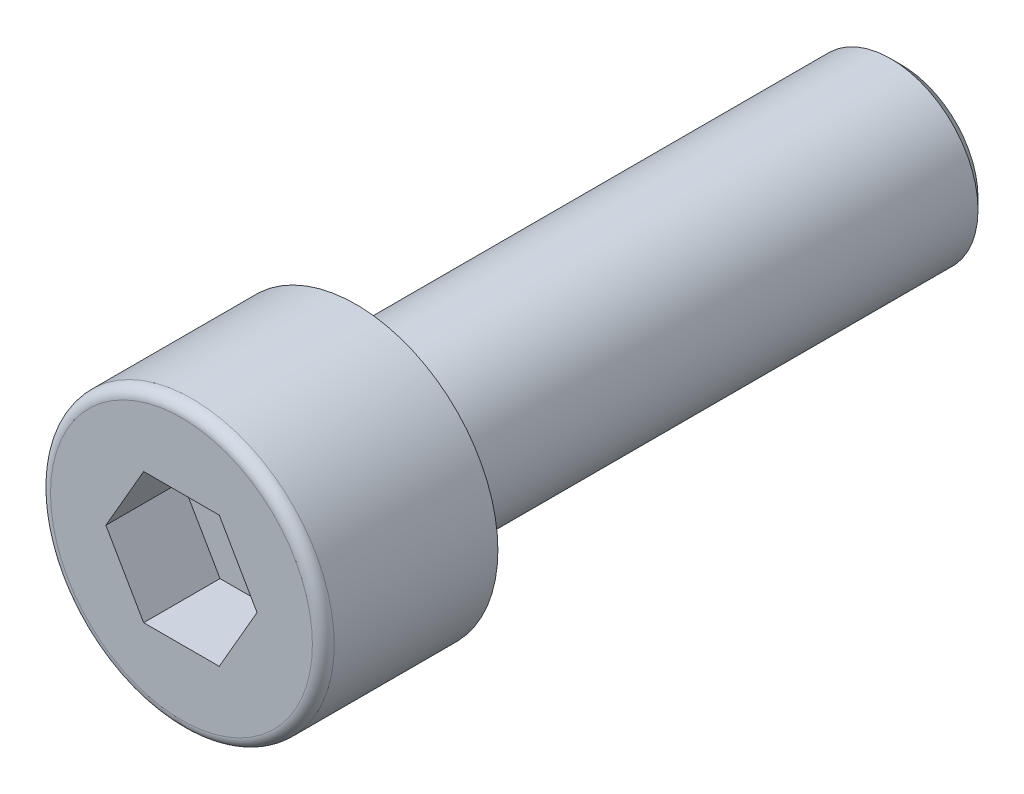
ISO-10303-21;
HEADER;
FILE_DESCRIPTION(('STEP AP214'),'2;1');
FILE_NAME('part.step','',(''),(''),'','','');
FILE_SCHEMA(('AUTOMOTIVE_DESIGN { 1 0 10303 214 1 1 1 1 }'));
ENDSEC;
DATA;
#1=APPLICATION_CONTEXT('core data for automotive mechanical design processes');
#2=APPLICATION_PROTOCOL_DEFINITION('international standard','automotive_design',2000,#1);
#3=PRODUCT_CONTEXT('',#1,'mechanical');
#4=PRODUCT('Part','Part','',(#3));
#5=PRODUCT_RELATED_PRODUCT_CATEGORY('part','',(#4));
#6=PRODUCT_DEFINITION_FORMATION('','',#4);
#7=PRODUCT_DEFINITION_CONTEXT('part definition',#1,'design');
#8=PRODUCT_DEFINITION('design','',#6,#7);
#9=PRODUCT_DEFINITION_SHAPE('','',#8);
#10=(LENGTH_UNIT() NAMED_UNIT(*) SI_UNIT(.MILLI.,.METRE.));
#11=(NAMED_UNIT(*) PLANE_ANGLE_UNIT() SI_UNIT($,.RADIAN.));
#12=(NAMED_UNIT(*) SI_UNIT($,.STERADIAN.) SOLID_ANGLE_UNIT());
#13=UNCERTAINTY_MEASURE_WITH_UNIT(LENGTH_MEASURE(1.E-05),#10,'distance_accuracy_value','');
#14=(GEOMETRIC_REPRESENTATION_CONTEXT(3) GLOBAL_UNCERTAINTY_ASSIGNED_CONTEXT((#13)) GLOBAL_UNIT_ASSIGNED_CONTEXT((#10,
#11,#12)) REPRESENTATION_CONTEXT('',''));
#15=CARTESIAN_POINT('',(0.,0.,0.));
#16=DIRECTION('',(0.,0.,1.));
#17=DIRECTION('',(1.,0.,0.));
#18=AXIS2_PLACEMENT_3D('',#15,#16,#17);
#19=CARTESIAN_POINT('',(0.,0.,25.));
#20=DIRECTION('',(0.,0.,-1.));
#21=DIRECTION('',(-1.,0.,0.));
#22=AXIS2_PLACEMENT_3D('',#19,#20,#21);
#23=CYLINDRICAL_SURFACE('',#22,4.);
#24=CARTESIAN_POINT('',(0.,0.,0.500000000000007));
#25=DIRECTION('',(0.,0.,1.));
#26=DIRECTION('',(1.,0.,0.));
#27=AXIS2_PLACEMENT_3D('',#24,#25,#26);
#28=CIRCLE('',#27,4.);
#29=CARTESIAN_POINT('',(4.,0.,0.500000000000007));
#30=VERTEX_POINT('',#29);
#31=EDGE_CURVE('E40',#30,#30,#28,.T.);
#32=ORIENTED_EDGE('',*,*,#31,.T.);
#33=EDGE_LOOP('',(#32));
#34=FACE_BOUND('',#33,.T.);
#35=CARTESIAN_POINT('',(0.,0.,25.));
#36=DIRECTION('',(0.,0.,1.));
#37=DIRECTION('',(1.,0.,0.));
#38=AXIS2_PLACEMENT_3D('',#35,#36,#37);
#39=CIRCLE('',#38,4.);
#40=CARTESIAN_POINT('',(4.,0.,25.));
#41=VERTEX_POINT('',#40);
#42=EDGE_CURVE('E143',#41,#41,#39,.T.);
#43=ORIENTED_EDGE('',*,*,#42,.F.);
#44=EDGE_LOOP('',(#43));
#45=FACE_BOUND('',#44,.T.);
#46=ADVANCED_FACE('F33',(#34,#45),#23,.T.);
#47=CARTESIAN_POINT('',(0.,0.,0.));
#48=DIRECTION('',(0.,0.,1.));
#49=DIRECTION('',(1.,0.,0.));
#50=AXIS2_PLACEMENT_3D('',#47,#48,#49);
#51=PLANE('',#50);
#52=CARTESIAN_POINT('',(0.,0.,0.));
#53=DIRECTION('',(0.,0.,1.));
#54=DIRECTION('',(1.,0.,0.));
#55=AXIS2_PLACEMENT_3D('',#52,#53,#54);
#56=CIRCLE('',#55,3.5);
#57=CARTESIAN_POINT('',(3.5,0.,0.));
#58=VERTEX_POINT('',#57);
#59=EDGE_CURVE('E11',#58,#58,#56,.F.);
#60=ORIENTED_EDGE('',*,*,#59,.T.);
#61=EDGE_LOOP('',(#60));
#62=FACE_BOUND('',#61,.T.);
#63=ADVANCED_FACE('F169',(#62),#51,.F.);
#64=CARTESIAN_POINT('',(0.,0.,25.));
#65=DIRECTION('',(0.,0.,1.));
#66=DIRECTION('',(1.,0.,0.));
#67=AXIS2_PLACEMENT_3D('',#64,#65,#66);
#68=PLANE('',#67);
#69=CARTESIAN_POINT('',(0.,0.,25.));
#70=DIRECTION('',(0.,0.,1.));
#71=DIRECTION('',(1.,0.,0.));
#72=AXIS2_PLACEMENT_3D('',#69,#70,#71);
#73=CIRCLE('',#72,6.5);
#74=CARTESIAN_POINT('',(6.5,0.,25.));
#75=VERTEX_POINT('',#74);
#76=EDGE_CURVE('E134',#75,#75,#73,.T.);
#77=ORIENTED_EDGE('',*,*,#76,.F.);
#78=EDGE_LOOP('',(#77));
#79=FACE_BOUND('',#78,.T.);
#80=ORIENTED_EDGE('',*,*,#42,.T.);
#81=EDGE_LOOP('',(#80));
#82=FACE_BOUND('',#81,.T.);
#83=ADVANCED_FACE('F173',(#79,#82),#68,.F.);
#84=CARTESIAN_POINT('',(0.,0.,33.));
#85=DIRECTION('',(0.,0.,-1.));
#86=DIRECTION('',(-1.,0.,0.));
#87=AXIS2_PLACEMENT_3D('',#84,#85,#86);
#88=CYLINDRICAL_SURFACE('',#87,6.5);
#89=CARTESIAN_POINT('',(0.,0.,32.5));
#90=DIRECTION('',(0.,0.,1.));
#91=DIRECTION('',(1.,0.,0.));
#92=AXIS2_PLACEMENT_3D('',#89,#90,#91);
#93=CIRCLE('',#92,6.5);
#94=CARTESIAN_POINT('',(6.5,0.,32.5));
#95=VERTEX_POINT('',#94);
#96=EDGE_CURVE('E149',#95,#95,#93,.F.);
#97=ORIENTED_EDGE('',*,*,#96,.T.);
#98=EDGE_LOOP('',(#97));
#99=FACE_BOUND('',#98,.T.);
#100=ORIENTED_EDGE('',*,*,#76,.T.);
#101=EDGE_LOOP('',(#100));
#102=FACE_BOUND('',#101,.T.);
#103=ADVANCED_FACE('F178',(#99,#102),#88,.T.);
#104=CARTESIAN_POINT('',(0.,0.,33.));
#105=DIRECTION('',(0.,0.,1.));
#106=DIRECTION('',(1.,0.,0.));
#107=AXIS2_PLACEMENT_3D('',#104,#105,#106);
#108=PLANE('',#107);
#109=CARTESIAN_POINT('',(0.,0.,33.));
#110=DIRECTION('',(0.,0.,1.));
#111=DIRECTION('',(1.,0.,0.));
#112=AXIS2_PLACEMENT_3D('',#109,#110,#111);
#113=CIRCLE('',#112,6.);
#114=CARTESIAN_POINT('',(6.,0.,33.));
#115=VERTEX_POINT('',#114);
#116=EDGE_CURVE('E146',#115,#115,#113,.T.);
#117=ORIENTED_EDGE('',*,*,#116,.T.);
#118=EDGE_LOOP('',(#117));
#119=FACE_BOUND('',#118,.T.);
#120=DIRECTION('',(0.5,0.866025403784439,0.));
#121=VECTOR('',#120,1.);
#122=CARTESIAN_POINT('',(3.46410161513775,0.,33.));
#123=LINE('',#122,#121);
#124=CARTESIAN_POINT('',(1.73205080756888,-3.,33.));
#125=VERTEX_POINT('',#124);
#126=CARTESIAN_POINT('',(3.46410161513775,0.,33.));
#127=VERTEX_POINT('',#126);
#128=EDGE_CURVE('E47',#125,#127,#123,.T.);
#129=ORIENTED_EDGE('',*,*,#128,.F.);
#130=DIRECTION('',(1.,0.,0.));
#131=VECTOR('',#130,1.);
#132=CARTESIAN_POINT('',(-1.73205080756888,-3.,33.));
#133=LINE('',#132,#131);
#134=CARTESIAN_POINT('',(-1.73205080756888,-3.,33.));
#135=VERTEX_POINT('',#134);
#136=EDGE_CURVE('E116',#135,#125,#133,.T.);
#137=ORIENTED_EDGE('',*,*,#136,.F.);
#138=DIRECTION('',(0.5,-0.866025403784439,0.));
#139=VECTOR('',#138,1.);
#140=CARTESIAN_POINT('',(-3.46410161513775,0.,33.));
#141=LINE('',#140,#139);
#142=CARTESIAN_POINT('',(-3.46410161513775,0.,33.));
#143=VERTEX_POINT('',#142);
#144=EDGE_CURVE('E110',#143,#135,#141,.T.);
#145=ORIENTED_EDGE('',*,*,#144,.F.);
#146=DIRECTION('',(-0.5,-0.866025403784439,0.));
#147=VECTOR('',#146,1.);
#148=CARTESIAN_POINT('',(-3.46410161513775,0.,33.));
#149=LINE('',#148,#147);
#150=CARTESIAN_POINT('',(-1.73205080756888,3.,33.));
#151=VERTEX_POINT('',#150);
#152=EDGE_CURVE('E108',#151,#143,#149,.T.);
#153=ORIENTED_EDGE('',*,*,#152,.F.);
#154=DIRECTION('',(-1.,0.,0.));
#155=VECTOR('',#154,1.);
#156=CARTESIAN_POINT('',(-1.73205080756888,3.,33.));
#157=LINE('',#156,#155);
#158=CARTESIAN_POINT('',(1.73205080756888,3.,33.));
#159=VERTEX_POINT('',#158);
#160=EDGE_CURVE('E90',#159,#151,#157,.T.);
#161=ORIENTED_EDGE('',*,*,#160,.F.);
#162=DIRECTION('',(-0.5,0.866025403784439,0.));
#163=VECTOR('',#162,1.);
#164=CARTESIAN_POINT('',(3.46410161513775,0.,33.));
#165=LINE('',#164,#163);
#166=EDGE_CURVE('E101',#127,#159,#165,.T.);
#167=ORIENTED_EDGE('',*,*,#166,.F.);
#168=EDGE_LOOP('',(#129,#137,#145,#153,#161,#167));
#169=FACE_BOUND('',#168,.T.);
#170=ADVANCED_FACE('F105',(#119,#169),#108,.T.);
#171=CARTESIAN_POINT('',(3.46410161513775,0.,29.5));
#172=DIRECTION('',(0.866025403784439,-0.5,0.));
#173=DIRECTION('',(0.5,0.866025403784439,0.));
#174=AXIS2_PLACEMENT_3D('',#171,#172,#173);
#175=PLANE('',#174);
#176=ORIENTED_EDGE('',*,*,#128,.T.);
#177=DIRECTION('',(0.,0.,1.));
#178=VECTOR('',#177,1.);
#179=CARTESIAN_POINT('',(3.46410161513775,0.,29.5));
#180=LINE('',#179,#178);
#181=CARTESIAN_POINT('',(3.46410161513775,0.,29.5));
#182=VERTEX_POINT('',#181);
#183=EDGE_CURVE('E98',#182,#127,#180,.T.);
#184=ORIENTED_EDGE('',*,*,#183,.F.);
#185=DIRECTION('',(0.5,0.866025403784439,0.));
#186=VECTOR('',#185,1.);
#187=CARTESIAN_POINT('',(3.46410161513775,0.,29.5));
#188=LINE('',#187,#186);
#189=CARTESIAN_POINT('',(1.73205080756888,-3.,29.5));
#190=VERTEX_POINT('',#189);
#191=EDGE_CURVE('E118',#190,#182,#188,.T.);
#192=ORIENTED_EDGE('',*,*,#191,.F.);
#193=DIRECTION('',(0.,0.,1.));
#194=VECTOR('',#193,1.);
#195=CARTESIAN_POINT('',(1.73205080756888,-3.,29.5));
#196=LINE('',#195,#194);
#197=EDGE_CURVE('E54',#190,#125,#196,.T.);
#198=ORIENTED_EDGE('',*,*,#197,.T.);
#199=EDGE_LOOP('',(#176,#184,#192,#198));
#200=FACE_BOUND('',#199,.T.);
#201=ADVANCED_FACE('F186',(#200),#175,.F.);
#202=CARTESIAN_POINT('',(-1.73205080756888,-3.,29.5));
#203=DIRECTION('',(0.,-1.,0.));
#204=DIRECTION('',(0.,0.,-1.));
#205=AXIS2_PLACEMENT_3D('',#202,#203,#204);
#206=PLANE('',#205);
#207=ORIENTED_EDGE('',*,*,#136,.T.);
#208=ORIENTED_EDGE('',*,*,#197,.F.);
#209=DIRECTION('',(1.,0.,0.));
#210=VECTOR('',#209,1.);
#211=CARTESIAN_POINT('',(-1.73205080756888,-3.,29.5));
#212=LINE('',#211,#210);
#213=CARTESIAN_POINT('',(-1.73205080756888,-3.,29.5));
#214=VERTEX_POINT('',#213);
#215=EDGE_CURVE('E130',#214,#190,#212,.T.);
#216=ORIENTED_EDGE('',*,*,#215,.F.);
#217=DIRECTION('',(0.,0.,1.));
#218=VECTOR('',#217,1.);
#219=CARTESIAN_POINT('',(-1.73205080756888,-3.,29.5));
#220=LINE('',#219,#218);
#221=EDGE_CURVE('E135',#214,#135,#220,.T.);
#222=ORIENTED_EDGE('',*,*,#221,.T.);
#223=EDGE_LOOP('',(#207,#208,#216,#222));
#224=FACE_BOUND('',#223,.T.);
#225=ADVANCED_FACE('F191',(#224),#206,.F.);
#226=CARTESIAN_POINT('',(-3.46410161513775,0.,29.5));
#227=DIRECTION('',(-0.866025403784439,-0.5,0.));
#228=DIRECTION('',(0.5,-0.866025403784439,0.));
#229=AXIS2_PLACEMENT_3D('',#226,#227,#228);
#230=PLANE('',#229);
#231=ORIENTED_EDGE('',*,*,#144,.T.);
#232=ORIENTED_EDGE('',*,*,#221,.F.);
#233=DIRECTION('',(0.5,-0.866025403784439,0.));
#234=VECTOR('',#233,1.);
#235=CARTESIAN_POINT('',(-3.46410161513775,0.,29.5));
#236=LINE('',#235,#234);
#237=CARTESIAN_POINT('',(-3.46410161513775,0.,29.5));
#238=VERTEX_POINT('',#237);
#239=EDGE_CURVE('E127',#238,#214,#236,.T.);
#240=ORIENTED_EDGE('',*,*,#239,.F.);
#241=DIRECTION('',(0.,0.,1.));
#242=VECTOR('',#241,1.);
#243=CARTESIAN_POINT('',(-3.46410161513775,0.,29.5));
#244=LINE('',#243,#242);
#245=EDGE_CURVE('E137',#238,#143,#244,.T.);
#246=ORIENTED_EDGE('',*,*,#245,.T.);
#247=EDGE_LOOP('',(#231,#232,#240,#246));
#248=FACE_BOUND('',#247,.T.);
#249=ADVANCED_FACE('F199',(#248),#230,.F.);
#250=CARTESIAN_POINT('',(-3.46410161513775,0.,29.5));
#251=DIRECTION('',(-0.866025403784439,0.5,0.));
#252=DIRECTION('',(-0.5,-0.866025403784439,0.));
#253=AXIS2_PLACEMENT_3D('',#250,#251,#252);
#254=PLANE('',#253);
#255=ORIENTED_EDGE('',*,*,#152,.T.);
#256=ORIENTED_EDGE('',*,*,#245,.F.);
#257=DIRECTION('',(-0.5,-0.866025403784439,0.));
#258=VECTOR('',#257,1.);
#259=CARTESIAN_POINT('',(-3.46410161513775,0.,29.5));
#260=LINE('',#259,#258);
#261=CARTESIAN_POINT('',(-1.73205080756888,3.,29.5));
#262=VERTEX_POINT('',#261);
#263=EDGE_CURVE('E124',#262,#238,#260,.T.);
#264=ORIENTED_EDGE('',*,*,#263,.F.);
#265=DIRECTION('',(0.,0.,1.));
#266=VECTOR('',#265,1.);
#267=CARTESIAN_POINT('',(-1.73205080756888,3.,29.5));
#268=LINE('',#267,#266);
#269=EDGE_CURVE('E97',#262,#151,#268,.T.);
#270=ORIENTED_EDGE('',*,*,#269,.T.);
#271=EDGE_LOOP('',(#255,#256,#264,#270));
#272=FACE_BOUND('',#271,.T.);
#273=ADVANCED_FACE('F196',(#272),#254,.F.);
#274=CARTESIAN_POINT('',(-1.73205080756888,3.,29.5));
#275=DIRECTION('',(0.,1.,0.));
#276=DIRECTION('',(0.,0.,1.));
#277=AXIS2_PLACEMENT_3D('',#274,#275,#276);
#278=PLANE('',#277);
#279=ORIENTED_EDGE('',*,*,#160,.T.);
#280=ORIENTED_EDGE('',*,*,#269,.F.);
#281=DIRECTION('',(-1.,0.,0.));
#282=VECTOR('',#281,1.);
#283=CARTESIAN_POINT('',(-1.73205080756888,3.,29.5));
#284=LINE('',#283,#282);
#285=CARTESIAN_POINT('',(1.73205080756888,3.,29.5));
#286=VERTEX_POINT('',#285);
#287=EDGE_CURVE('E93',#286,#262,#284,.T.);
#288=ORIENTED_EDGE('',*,*,#287,.F.);
#289=DIRECTION('',(0.,0.,1.));
#290=VECTOR('',#289,1.);
#291=CARTESIAN_POINT('',(1.73205080756888,3.,29.5));
#292=LINE('',#291,#290);
#293=EDGE_CURVE('E86',#286,#159,#292,.T.);
#294=ORIENTED_EDGE('',*,*,#293,.T.);
#295=EDGE_LOOP('',(#279,#280,#288,#294));
#296=FACE_BOUND('',#295,.T.);
#297=ADVANCED_FACE('F88',(#296),#278,.F.);
#298=CARTESIAN_POINT('',(3.46410161513775,0.,29.5));
#299=DIRECTION('',(0.866025403784439,0.5,0.));
#300=DIRECTION('',(-0.5,0.866025403784439,0.));
#301=AXIS2_PLACEMENT_3D('',#298,#299,#300);
#302=PLANE('',#301);
#303=ORIENTED_EDGE('',*,*,#166,.T.);
#304=ORIENTED_EDGE('',*,*,#293,.F.);
#305=DIRECTION('',(-0.5,0.866025403784439,0.));
#306=VECTOR('',#305,1.);
#307=CARTESIAN_POINT('',(3.46410161513775,0.,29.5));
#308=LINE('',#307,#306);
#309=EDGE_CURVE('E121',#182,#286,#308,.T.);
#310=ORIENTED_EDGE('',*,*,#309,.F.);
#311=ORIENTED_EDGE('',*,*,#183,.T.);
#312=EDGE_LOOP('',(#303,#304,#310,#311));
#313=FACE_BOUND('',#312,.T.);
#314=ADVANCED_FACE('F102',(#313),#302,.F.);
#315=CARTESIAN_POINT('',(1.73205080756888,-3.,29.5));
#316=DIRECTION('',(0.,0.,1.));
#317=DIRECTION('',(1.,0.,0.));
#318=AXIS2_PLACEMENT_3D('',#315,#316,#317);
#319=PLANE('',#318);
#320=ORIENTED_EDGE('',*,*,#191,.T.);
#321=ORIENTED_EDGE('',*,*,#309,.T.);
#322=ORIENTED_EDGE('',*,*,#287,.T.);
#323=ORIENTED_EDGE('',*,*,#263,.T.);
#324=ORIENTED_EDGE('',*,*,#239,.T.);
#325=ORIENTED_EDGE('',*,*,#215,.T.);
#326=EDGE_LOOP('',(#320,#321,#322,#323,#324,#325));
#327=FACE_BOUND('',#326,.T.);
#328=ADVANCED_FACE('F164',(#327),#319,.T.);
#329=CARTESIAN_POINT('',(0.,0.,32.5));
#330=DIRECTION('',(0.,0.,1.));
#331=DIRECTION('',(1.,0.,0.));
#332=AXIS2_PLACEMENT_3D('',#329,#330,#331);
#333=TOROIDAL_SURFACE('',#332,6.,0.5);
#334=ORIENTED_EDGE('',*,*,#96,.F.);
#335=EDGE_LOOP('',(#334));
#336=FACE_BOUND('',#335,.T.);
#337=ORIENTED_EDGE('',*,*,#116,.F.);
#338=EDGE_LOOP('',(#337));
#339=FACE_BOUND('',#338,.T.);
#340=ADVANCED_FACE('F158',(#336,#339),#333,.T.);
#341=CARTESIAN_POINT('',(0.,0.,0.500000000000007));
#342=DIRECTION('',(0.,0.,1.));
#343=DIRECTION('',(1.,0.,0.));
#344=AXIS2_PLACEMENT_3D('',#341,#342,#343);
#345=CONICAL_SURFACE('',#344,4.,0.785398163397445);
#346=ORIENTED_EDGE('',*,*,#59,.F.);
#347=EDGE_LOOP('',(#346));
#348=FACE_BOUND('',#347,.T.);
#349=ORIENTED_EDGE('',*,*,#31,.F.);
#350=EDGE_LOOP('',(#349));
#351=FACE_BOUND('',#350,.T.);
#352=ADVANCED_FACE('F156',(#348,#351),#345,.T.);
#353=CLOSED_SHELL('',(#46,#63,#83,#103,#170,#201,#225,#249,#273,#297,#314,#328,#340,#352));
#354=MANIFOLD_SOLID_BREP('B2',#353);
#355=ADVANCED_BREP_SHAPE_REPRESENTATION('',(#18,#354),#14);
#356=SHAPE_DEFINITION_REPRESENTATION(#9,#355);
ENDSEC;
END-ISO-10303-21;
